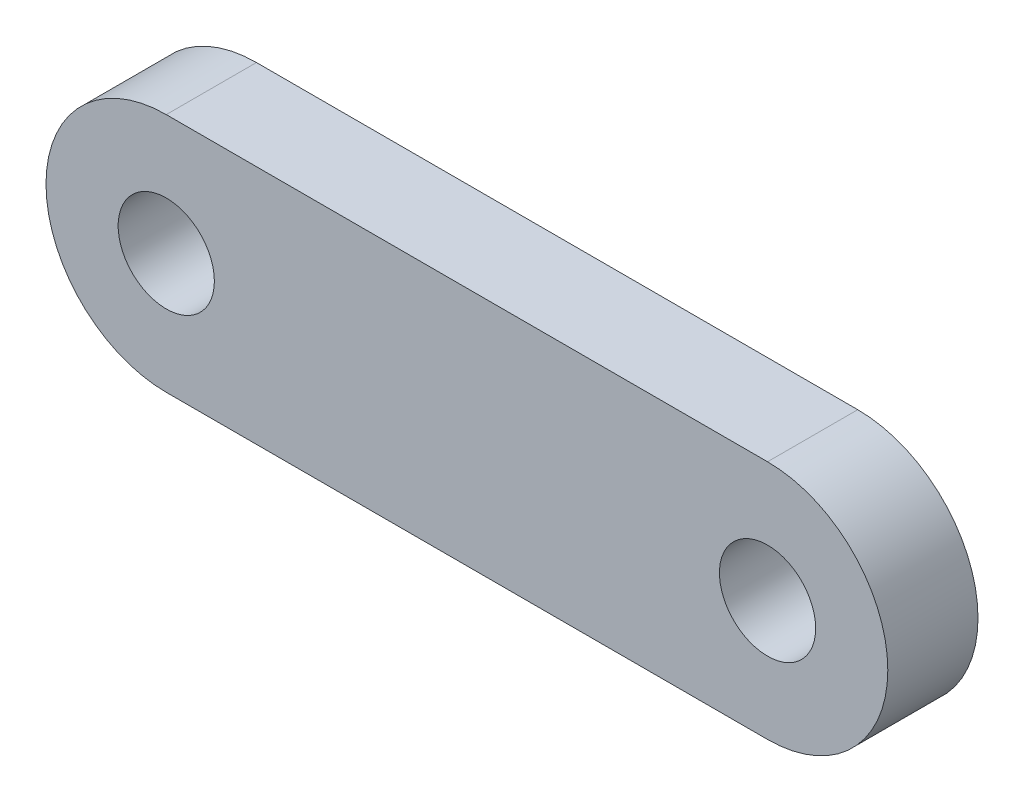
ISO-10303-21;
HEADER;
FILE_DESCRIPTION(('STEP AP214'),'2;1');
FILE_NAME('part.step','',(''),(''),'','','');
FILE_SCHEMA(('AUTOMOTIVE_DESIGN { 1 0 10303 214 1 1 1 1 }'));
ENDSEC;
DATA;
#1=APPLICATION_CONTEXT('core data for automotive mechanical design processes');
#2=APPLICATION_PROTOCOL_DEFINITION('international standard','automotive_design',2000,#1);
#3=PRODUCT_CONTEXT('',#1,'mechanical');
#4=PRODUCT('Part','Part','',(#3));
#5=PRODUCT_RELATED_PRODUCT_CATEGORY('part','',(#4));
#6=PRODUCT_DEFINITION_FORMATION('','',#4);
#7=PRODUCT_DEFINITION_CONTEXT('part definition',#1,'design');
#8=PRODUCT_DEFINITION('design','',#6,#7);
#9=PRODUCT_DEFINITION_SHAPE('','',#8);
#10=(LENGTH_UNIT() NAMED_UNIT(*) SI_UNIT(.MILLI.,.METRE.));
#11=(NAMED_UNIT(*) PLANE_ANGLE_UNIT() SI_UNIT($,.RADIAN.));
#12=(NAMED_UNIT(*) SI_UNIT($,.STERADIAN.) SOLID_ANGLE_UNIT());
#13=UNCERTAINTY_MEASURE_WITH_UNIT(LENGTH_MEASURE(1.E-05),#10,'distance_accuracy_value','');
#14=(GEOMETRIC_REPRESENTATION_CONTEXT(3) GLOBAL_UNCERTAINTY_ASSIGNED_CONTEXT((#13)) GLOBAL_UNIT_ASSIGNED_CONTEXT((#10,
#11,#12)) REPRESENTATION_CONTEXT('',''));
#15=CARTESIAN_POINT('',(0.,0.,0.));
#16=DIRECTION('',(0.,0.,1.));
#17=DIRECTION('',(1.,0.,0.));
#18=AXIS2_PLACEMENT_3D('',#15,#16,#17);
#19=CARTESIAN_POINT('',(-10.,0.,3.));
#20=DIRECTION('',(0.,0.,1.));
#21=DIRECTION('',(1.,0.,0.));
#22=AXIS2_PLACEMENT_3D('',#19,#20,#21);
#23=PLANE('',#22);
#24=CARTESIAN_POINT('',(10.,0.,3.));
#25=DIRECTION('',(0.,0.,1.));
#26=DIRECTION('',(1.,0.,0.));
#27=AXIS2_PLACEMENT_3D('',#24,#25,#26);
#28=CIRCLE('',#27,1.6);
#29=CARTESIAN_POINT('',(11.6,0.,3.));
#30=VERTEX_POINT('',#29);
#31=EDGE_CURVE('E100',#30,#30,#28,.T.);
#32=ORIENTED_EDGE('',*,*,#31,.F.);
#33=EDGE_LOOP('',(#32));
#34=FACE_BOUND('',#33,.T.);
#35=CARTESIAN_POINT('',(-10.,0.,3.));
#36=DIRECTION('',(0.,0.,1.));
#37=DIRECTION('',(1.,0.,0.));
#38=AXIS2_PLACEMENT_3D('',#35,#36,#37);
#39=CIRCLE('',#38,4.);
#40=CARTESIAN_POINT('',(-10.,4.,3.));
#41=VERTEX_POINT('',#40);
#42=CARTESIAN_POINT('',(-10.,-4.,3.));
#43=VERTEX_POINT('',#42);
#44=EDGE_CURVE('E85',#41,#43,#39,.T.);
#45=ORIENTED_EDGE('',*,*,#44,.T.);
#46=DIRECTION('',(1.,0.,0.));
#47=VECTOR('',#46,1.);
#48=CARTESIAN_POINT('',(-10.,-4.,3.));
#49=LINE('',#48,#47);
#50=CARTESIAN_POINT('',(10.,-4.,3.));
#51=VERTEX_POINT('',#50);
#52=EDGE_CURVE('E80',#43,#51,#49,.T.);
#53=ORIENTED_EDGE('',*,*,#52,.T.);
#54=CARTESIAN_POINT('',(10.,0.,3.));
#55=DIRECTION('',(0.,0.,1.));
#56=DIRECTION('',(1.,0.,0.));
#57=AXIS2_PLACEMENT_3D('',#54,#55,#56);
#58=CIRCLE('',#57,4.);
#59=CARTESIAN_POINT('',(10.,4.,3.));
#60=VERTEX_POINT('',#59);
#61=EDGE_CURVE('E83',#51,#60,#58,.T.);
#62=ORIENTED_EDGE('',*,*,#61,.T.);
#63=DIRECTION('',(-1.,0.,0.));
#64=VECTOR('',#63,1.);
#65=CARTESIAN_POINT('',(-10.,4.,3.));
#66=LINE('',#65,#64);
#67=EDGE_CURVE('E50',#60,#41,#66,.T.);
#68=ORIENTED_EDGE('',*,*,#67,.T.);
#69=EDGE_LOOP('',(#45,#53,#62,#68));
#70=FACE_BOUND('',#69,.T.);
#71=CARTESIAN_POINT('',(-10.,0.,3.));
#72=DIRECTION('',(0.,0.,1.));
#73=DIRECTION('',(1.,0.,0.));
#74=AXIS2_PLACEMENT_3D('',#71,#72,#73);
#75=CIRCLE('',#74,1.6);
#76=CARTESIAN_POINT('',(-8.4,0.,3.));
#77=VERTEX_POINT('',#76);
#78=EDGE_CURVE('E115',#77,#77,#75,.T.);
#79=ORIENTED_EDGE('',*,*,#78,.F.);
#80=EDGE_LOOP('',(#79));
#81=FACE_BOUND('',#80,.T.);
#82=ADVANCED_FACE('F33',(#34,#70,#81),#23,.T.);
#83=CARTESIAN_POINT('',(-10.,0.,0.));
#84=DIRECTION('',(0.,0.,1.));
#85=DIRECTION('',(1.,0.,0.));
#86=AXIS2_PLACEMENT_3D('',#83,#84,#85);
#87=PLANE('',#86);
#88=CARTESIAN_POINT('',(-10.,0.,0.));
#89=DIRECTION('',(0.,0.,1.));
#90=DIRECTION('',(1.,0.,0.));
#91=AXIS2_PLACEMENT_3D('',#88,#89,#90);
#92=CIRCLE('',#91,4.);
#93=CARTESIAN_POINT('',(-10.,4.,0.));
#94=VERTEX_POINT('',#93);
#95=CARTESIAN_POINT('',(-10.,-4.,0.));
#96=VERTEX_POINT('',#95);
#97=EDGE_CURVE('E97',#94,#96,#92,.T.);
#98=ORIENTED_EDGE('',*,*,#97,.F.);
#99=DIRECTION('',(-1.,0.,0.));
#100=VECTOR('',#99,1.);
#101=CARTESIAN_POINT('',(-10.,4.,0.));
#102=LINE('',#101,#100);
#103=CARTESIAN_POINT('',(10.,4.,0.));
#104=VERTEX_POINT('',#103);
#105=EDGE_CURVE('E73',#104,#94,#102,.T.);
#106=ORIENTED_EDGE('',*,*,#105,.F.);
#107=CARTESIAN_POINT('',(10.,0.,0.));
#108=DIRECTION('',(0.,0.,1.));
#109=DIRECTION('',(1.,0.,0.));
#110=AXIS2_PLACEMENT_3D('',#107,#108,#109);
#111=CIRCLE('',#110,4.);
#112=CARTESIAN_POINT('',(10.,-4.,0.));
#113=VERTEX_POINT('',#112);
#114=EDGE_CURVE('E67',#113,#104,#111,.T.);
#115=ORIENTED_EDGE('',*,*,#114,.F.);
#116=DIRECTION('',(1.,0.,0.));
#117=VECTOR('',#116,1.);
#118=CARTESIAN_POINT('',(-10.,-4.,0.));
#119=LINE('',#118,#117);
#120=EDGE_CURVE('E89',#96,#113,#119,.T.);
#121=ORIENTED_EDGE('',*,*,#120,.F.);
#122=EDGE_LOOP('',(#98,#106,#115,#121));
#123=FACE_BOUND('',#122,.T.);
#124=CARTESIAN_POINT('',(10.,0.,0.));
#125=DIRECTION('',(0.,0.,1.));
#126=DIRECTION('',(1.,0.,0.));
#127=AXIS2_PLACEMENT_3D('',#124,#125,#126);
#128=CIRCLE('',#127,1.6);
#129=CARTESIAN_POINT('',(11.6,0.,0.));
#130=VERTEX_POINT('',#129);
#131=EDGE_CURVE('E112',#130,#130,#128,.T.);
#132=ORIENTED_EDGE('',*,*,#131,.T.);
#133=EDGE_LOOP('',(#132));
#134=FACE_BOUND('',#133,.T.);
#135=CARTESIAN_POINT('',(-10.,0.,0.));
#136=DIRECTION('',(0.,0.,1.));
#137=DIRECTION('',(1.,0.,0.));
#138=AXIS2_PLACEMENT_3D('',#135,#136,#137);
#139=CIRCLE('',#138,1.6);
#140=CARTESIAN_POINT('',(-8.4,0.,0.));
#141=VERTEX_POINT('',#140);
#142=EDGE_CURVE('E118',#141,#141,#139,.T.);
#143=ORIENTED_EDGE('',*,*,#142,.T.);
#144=EDGE_LOOP('',(#143));
#145=FACE_BOUND('',#144,.T.);
#146=ADVANCED_FACE('F108',(#123,#134,#145),#87,.F.);
#147=CARTESIAN_POINT('',(-10.,0.,3.));
#148=DIRECTION('',(0.,0.,-1.));
#149=DIRECTION('',(-1.,0.,0.));
#150=AXIS2_PLACEMENT_3D('',#147,#148,#149);
#151=CYLINDRICAL_SURFACE('',#150,4.);
#152=ORIENTED_EDGE('',*,*,#97,.T.);
#153=DIRECTION('',(0.,0.,-1.));
#154=VECTOR('',#153,1.);
#155=CARTESIAN_POINT('',(-10.,-4.,3.));
#156=LINE('',#155,#154);
#157=EDGE_CURVE('E11',#43,#96,#156,.T.);
#158=ORIENTED_EDGE('',*,*,#157,.F.);
#159=ORIENTED_EDGE('',*,*,#44,.F.);
#160=DIRECTION('',(0.,0.,-1.));
#161=VECTOR('',#160,1.);
#162=CARTESIAN_POINT('',(-10.,4.,3.));
#163=LINE('',#162,#161);
#164=EDGE_CURVE('E93',#41,#94,#163,.T.);
#165=ORIENTED_EDGE('',*,*,#164,.T.);
#166=EDGE_LOOP('',(#152,#158,#159,#165));
#167=FACE_BOUND('',#166,.T.);
#168=ADVANCED_FACE('F35',(#167),#151,.T.);
#169=CARTESIAN_POINT('',(-10.,-4.,3.));
#170=DIRECTION('',(0.,1.,0.));
#171=DIRECTION('',(-1.,0.,0.));
#172=AXIS2_PLACEMENT_3D('',#169,#170,#171);
#173=PLANE('',#172);
#174=ORIENTED_EDGE('',*,*,#120,.T.);
#175=DIRECTION('',(0.,0.,-1.));
#176=VECTOR('',#175,1.);
#177=CARTESIAN_POINT('',(10.,-4.,3.));
#178=LINE('',#177,#176);
#179=EDGE_CURVE('E42',#51,#113,#178,.T.);
#180=ORIENTED_EDGE('',*,*,#179,.F.);
#181=ORIENTED_EDGE('',*,*,#52,.F.);
#182=ORIENTED_EDGE('',*,*,#157,.T.);
#183=EDGE_LOOP('',(#174,#180,#181,#182));
#184=FACE_BOUND('',#183,.T.);
#185=ADVANCED_FACE('F88',(#184),#173,.F.);
#186=CARTESIAN_POINT('',(10.,0.,3.));
#187=DIRECTION('',(0.,0.,-1.));
#188=DIRECTION('',(-1.,0.,0.));
#189=AXIS2_PLACEMENT_3D('',#186,#187,#188);
#190=CYLINDRICAL_SURFACE('',#189,4.);
#191=ORIENTED_EDGE('',*,*,#114,.T.);
#192=DIRECTION('',(0.,0.,-1.));
#193=VECTOR('',#192,1.);
#194=CARTESIAN_POINT('',(10.,4.,3.));
#195=LINE('',#194,#193);
#196=EDGE_CURVE('E90',#60,#104,#195,.T.);
#197=ORIENTED_EDGE('',*,*,#196,.F.);
#198=ORIENTED_EDGE('',*,*,#61,.F.);
#199=ORIENTED_EDGE('',*,*,#179,.T.);
#200=EDGE_LOOP('',(#191,#197,#198,#199));
#201=FACE_BOUND('',#200,.T.);
#202=ADVANCED_FACE('F91',(#201),#190,.T.);
#203=CARTESIAN_POINT('',(-10.,4.,3.));
#204=DIRECTION('',(0.,-1.,0.));
#205=DIRECTION('',(1.,0.,0.));
#206=AXIS2_PLACEMENT_3D('',#203,#204,#205);
#207=PLANE('',#206);
#208=ORIENTED_EDGE('',*,*,#105,.T.);
#209=ORIENTED_EDGE('',*,*,#164,.F.);
#210=ORIENTED_EDGE('',*,*,#67,.F.);
#211=ORIENTED_EDGE('',*,*,#196,.T.);
#212=EDGE_LOOP('',(#208,#209,#210,#211));
#213=FACE_BOUND('',#212,.T.);
#214=ADVANCED_FACE('F105',(#213),#207,.F.);
#215=CARTESIAN_POINT('',(10.,0.,3.));
#216=DIRECTION('',(0.,0.,-1.));
#217=DIRECTION('',(-1.,0.,0.));
#218=AXIS2_PLACEMENT_3D('',#215,#216,#217);
#219=CYLINDRICAL_SURFACE('',#218,1.6);
#220=ORIENTED_EDGE('',*,*,#31,.T.);
#221=EDGE_LOOP('',(#220));
#222=FACE_BOUND('',#221,.T.);
#223=ORIENTED_EDGE('',*,*,#131,.F.);
#224=EDGE_LOOP('',(#223));
#225=FACE_BOUND('',#224,.T.);
#226=ADVANCED_FACE('F135',(#222,#225),#219,.F.);
#227=CARTESIAN_POINT('',(-10.,0.,3.));
#228=DIRECTION('',(0.,0.,-1.));
#229=DIRECTION('',(-1.,0.,0.));
#230=AXIS2_PLACEMENT_3D('',#227,#228,#229);
#231=CYLINDRICAL_SURFACE('',#230,1.6);
#232=ORIENTED_EDGE('',*,*,#78,.T.);
#233=EDGE_LOOP('',(#232));
#234=FACE_BOUND('',#233,.T.);
#235=ORIENTED_EDGE('',*,*,#142,.F.);
#236=EDGE_LOOP('',(#235));
#237=FACE_BOUND('',#236,.T.);
#238=ADVANCED_FACE('F124',(#234,#237),#231,.F.);
#239=CLOSED_SHELL('',(#82,#146,#168,#185,#202,#214,#226,#238));
#240=MANIFOLD_SOLID_BREP('B2',#239);
#241=ADVANCED_BREP_SHAPE_REPRESENTATION('',(#18,#240),#14);
#242=SHAPE_DEFINITION_REPRESENTATION(#9,#241);
ENDSEC;
END-ISO-10303-21;
